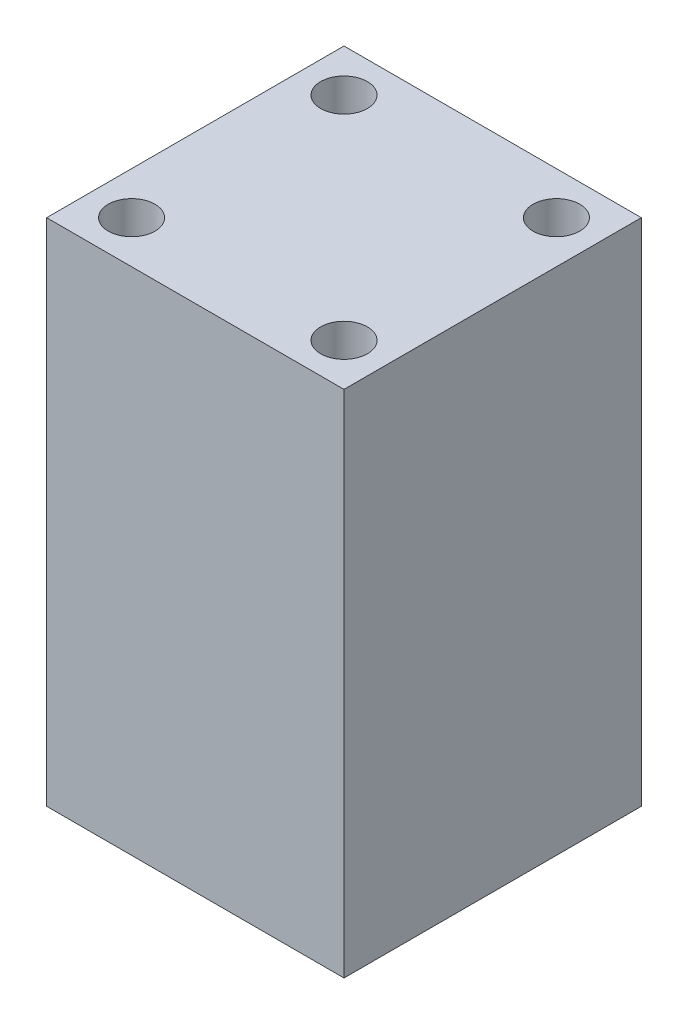
ISO-10303-21;
HEADER;
FILE_DESCRIPTION(('STEP AP214'),'2;1');
FILE_NAME('part.step','',(''),(''),'','','');
FILE_SCHEMA(('AUTOMOTIVE_DESIGN { 1 0 10303 214 1 1 1 1 }'));
ENDSEC;
DATA;
#1=APPLICATION_CONTEXT('core data for automotive mechanical design processes');
#2=APPLICATION_PROTOCOL_DEFINITION('international standard','automotive_design',2000,#1);
#3=PRODUCT_CONTEXT('',#1,'mechanical');
#4=PRODUCT('Part','Part','',(#3));
#5=PRODUCT_RELATED_PRODUCT_CATEGORY('part','',(#4));
#6=PRODUCT_DEFINITION_FORMATION('','',#4);
#7=PRODUCT_DEFINITION_CONTEXT('part definition',#1,'design');
#8=PRODUCT_DEFINITION('design','',#6,#7);
#9=PRODUCT_DEFINITION_SHAPE('','',#8);
#10=(LENGTH_UNIT() NAMED_UNIT(*) SI_UNIT(.MILLI.,.METRE.));
#11=(NAMED_UNIT(*) PLANE_ANGLE_UNIT() SI_UNIT($,.RADIAN.));
#12=(NAMED_UNIT(*) SI_UNIT($,.STERADIAN.) SOLID_ANGLE_UNIT());
#13=UNCERTAINTY_MEASURE_WITH_UNIT(LENGTH_MEASURE(1.E-05),#10,'distance_accuracy_value','');
#14=(GEOMETRIC_REPRESENTATION_CONTEXT(3) GLOBAL_UNCERTAINTY_ASSIGNED_CONTEXT((#13)) GLOBAL_UNIT_ASSIGNED_CONTEXT((#10,
#11,#12)) REPRESENTATION_CONTEXT('',''));
#15=CARTESIAN_POINT('',(0.,0.,0.));
#16=DIRECTION('',(0.,0.,1.));
#17=DIRECTION('',(1.,0.,0.));
#18=AXIS2_PLACEMENT_3D('',#15,#16,#17);
#19=CARTESIAN_POINT('',(17.5,30.,-17.5));
#20=DIRECTION('',(-1.,0.,0.));
#21=DIRECTION('',(0.,0.,1.));
#22=AXIS2_PLACEMENT_3D('',#19,#20,#21);
#23=PLANE('',#22);
#24=DIRECTION('',(0.,0.,-1.));
#25=VECTOR('',#24,1.);
#26=CARTESIAN_POINT('',(17.5,-30.,-17.5));
#27=LINE('',#26,#25);
#28=CARTESIAN_POINT('',(17.5,-30.,17.5));
#29=VERTEX_POINT('',#28);
#30=CARTESIAN_POINT('',(17.5,-30.,-17.5));
#31=VERTEX_POINT('',#30);
#32=EDGE_CURVE('E206',#29,#31,#27,.T.);
#33=ORIENTED_EDGE('',*,*,#32,.T.);
#34=DIRECTION('',(0.,-1.,0.));
#35=VECTOR('',#34,1.);
#36=CARTESIAN_POINT('',(17.5,30.,-17.5));
#37=LINE('',#36,#35);
#38=CARTESIAN_POINT('',(17.5,30.,-17.5));
#39=VERTEX_POINT('',#38);
#40=EDGE_CURVE('E11',#39,#31,#37,.T.);
#41=ORIENTED_EDGE('',*,*,#40,.F.);
#42=DIRECTION('',(0.,0.,-1.));
#43=VECTOR('',#42,1.);
#44=CARTESIAN_POINT('',(17.5,30.,-17.5));
#45=LINE('',#44,#43);
#46=CARTESIAN_POINT('',(17.5,30.,17.5));
#47=VERTEX_POINT('',#46);
#48=EDGE_CURVE('E207',#47,#39,#45,.T.);
#49=ORIENTED_EDGE('',*,*,#48,.F.);
#50=DIRECTION('',(0.,-1.,0.));
#51=VECTOR('',#50,1.);
#52=CARTESIAN_POINT('',(17.5,30.,17.5));
#53=LINE('',#52,#51);
#54=EDGE_CURVE('E213',#47,#29,#53,.T.);
#55=ORIENTED_EDGE('',*,*,#54,.T.);
#56=EDGE_LOOP('',(#33,#41,#49,#55));
#57=FACE_BOUND('',#56,.T.);
#58=ADVANCED_FACE('F41',(#57),#23,.F.);
#59=CARTESIAN_POINT('',(-17.5,30.,-17.5));
#60=DIRECTION('',(0.,0.,1.));
#61=DIRECTION('',(1.,0.,0.));
#62=AXIS2_PLACEMENT_3D('',#59,#60,#61);
#63=PLANE('',#62);
#64=DIRECTION('',(-1.,0.,0.));
#65=VECTOR('',#64,1.);
#66=CARTESIAN_POINT('',(-17.5,-30.,-17.5));
#67=LINE('',#66,#65);
#68=CARTESIAN_POINT('',(-17.5,-30.,-17.5));
#69=VERTEX_POINT('',#68);
#70=EDGE_CURVE('E216',#31,#69,#67,.T.);
#71=ORIENTED_EDGE('',*,*,#70,.T.);
#72=DIRECTION('',(0.,-1.,0.));
#73=VECTOR('',#72,1.);
#74=CARTESIAN_POINT('',(-17.5,30.,-17.5));
#75=LINE('',#74,#73);
#76=CARTESIAN_POINT('',(-17.5,30.,-17.5));
#77=VERTEX_POINT('',#76);
#78=EDGE_CURVE('E49',#77,#69,#75,.T.);
#79=ORIENTED_EDGE('',*,*,#78,.F.);
#80=DIRECTION('',(-1.,0.,0.));
#81=VECTOR('',#80,1.);
#82=CARTESIAN_POINT('',(-17.5,30.,-17.5));
#83=LINE('',#82,#81);
#84=EDGE_CURVE('E88',#39,#77,#83,.T.);
#85=ORIENTED_EDGE('',*,*,#84,.F.);
#86=ORIENTED_EDGE('',*,*,#40,.T.);
#87=EDGE_LOOP('',(#71,#79,#85,#86));
#88=FACE_BOUND('',#87,.T.);
#89=ADVANCED_FACE('F242',(#88),#63,.F.);
#90=CARTESIAN_POINT('',(-17.5,30.,-17.5));
#91=DIRECTION('',(1.,0.,0.));
#92=DIRECTION('',(0.,0.,-1.));
#93=AXIS2_PLACEMENT_3D('',#90,#91,#92);
#94=PLANE('',#93);
#95=CARTESIAN_POINT('',(-17.5,-15.,-12.5));
#96=DIRECTION('',(-1.,0.,0.));
#97=DIRECTION('',(0.,0.,1.));
#98=AXIS2_PLACEMENT_3D('',#95,#96,#97);
#99=CIRCLE('',#98,2.24999999999999);
#100=CARTESIAN_POINT('',(-17.5,-15.,-10.25));
#101=VERTEX_POINT('',#100);
#102=EDGE_CURVE('E136',#101,#101,#99,.T.);
#103=ORIENTED_EDGE('',*,*,#102,.F.);
#104=EDGE_LOOP('',(#103));
#105=FACE_BOUND('',#104,.T.);
#106=CARTESIAN_POINT('',(-17.5,-15.,12.5));
#107=DIRECTION('',(-1.,0.,0.));
#108=DIRECTION('',(0.,0.,1.));
#109=AXIS2_PLACEMENT_3D('',#106,#107,#108);
#110=CIRCLE('',#109,2.24999999999999);
#111=CARTESIAN_POINT('',(-17.5,-15.,14.75));
#112=VERTEX_POINT('',#111);
#113=EDGE_CURVE('E135',#112,#112,#110,.T.);
#114=ORIENTED_EDGE('',*,*,#113,.F.);
#115=EDGE_LOOP('',(#114));
#116=FACE_BOUND('',#115,.T.);
#117=CARTESIAN_POINT('',(-17.5,15.,12.5));
#118=DIRECTION('',(-1.,0.,0.));
#119=DIRECTION('',(0.,0.,1.));
#120=AXIS2_PLACEMENT_3D('',#117,#118,#119);
#121=CIRCLE('',#120,2.24999999999999);
#122=CARTESIAN_POINT('',(-17.5,15.,14.75));
#123=VERTEX_POINT('',#122);
#124=EDGE_CURVE('E146',#123,#123,#121,.T.);
#125=ORIENTED_EDGE('',*,*,#124,.F.);
#126=EDGE_LOOP('',(#125));
#127=FACE_BOUND('',#126,.T.);
#128=CARTESIAN_POINT('',(-17.5,15.,-12.5));
#129=DIRECTION('',(-1.,0.,0.));
#130=DIRECTION('',(0.,0.,1.));
#131=AXIS2_PLACEMENT_3D('',#128,#129,#130);
#132=CIRCLE('',#131,2.24999999999999);
#133=CARTESIAN_POINT('',(-17.5,15.,-10.25));
#134=VERTEX_POINT('',#133);
#135=EDGE_CURVE('E152',#134,#134,#132,.T.);
#136=ORIENTED_EDGE('',*,*,#135,.F.);
#137=EDGE_LOOP('',(#136));
#138=FACE_BOUND('',#137,.T.);
#139=DIRECTION('',(0.,0.,1.));
#140=VECTOR('',#139,1.);
#141=CARTESIAN_POINT('',(-17.5,-30.,-17.5));
#142=LINE('',#141,#140);
#143=CARTESIAN_POINT('',(-17.5,-30.,17.5));
#144=VERTEX_POINT('',#143);
#145=EDGE_CURVE('E75',#69,#144,#142,.T.);
#146=ORIENTED_EDGE('',*,*,#145,.T.);
#147=DIRECTION('',(0.,-1.,0.));
#148=VECTOR('',#147,1.);
#149=CARTESIAN_POINT('',(-17.5,30.,17.5));
#150=LINE('',#149,#148);
#151=CARTESIAN_POINT('',(-17.5,30.,17.5));
#152=VERTEX_POINT('',#151);
#153=EDGE_CURVE('E221',#152,#144,#150,.T.);
#154=ORIENTED_EDGE('',*,*,#153,.F.);
#155=DIRECTION('',(0.,0.,1.));
#156=VECTOR('',#155,1.);
#157=CARTESIAN_POINT('',(-17.5,30.,-17.5));
#158=LINE('',#157,#156);
#159=EDGE_CURVE('E210',#77,#152,#158,.T.);
#160=ORIENTED_EDGE('',*,*,#159,.F.);
#161=ORIENTED_EDGE('',*,*,#78,.T.);
#162=EDGE_LOOP('',(#146,#154,#160,#161));
#163=FACE_BOUND('',#162,.T.);
#164=ADVANCED_FACE('F223',(#105,#116,#127,#138,#163),#94,.F.);
#165=CARTESIAN_POINT('',(-17.5,30.,17.5));
#166=DIRECTION('',(0.,0.,-1.));
#167=DIRECTION('',(-1.,0.,0.));
#168=AXIS2_PLACEMENT_3D('',#165,#166,#167);
#169=PLANE('',#168);
#170=DIRECTION('',(1.,0.,0.));
#171=VECTOR('',#170,1.);
#172=CARTESIAN_POINT('',(-17.5,-30.,17.5));
#173=LINE('',#172,#171);
#174=EDGE_CURVE('E81',#144,#29,#173,.T.);
#175=ORIENTED_EDGE('',*,*,#174,.T.);
#176=ORIENTED_EDGE('',*,*,#54,.F.);
#177=DIRECTION('',(1.,0.,0.));
#178=VECTOR('',#177,1.);
#179=CARTESIAN_POINT('',(-17.5,30.,17.5));
#180=LINE('',#179,#178);
#181=EDGE_CURVE('E57',#152,#47,#180,.T.);
#182=ORIENTED_EDGE('',*,*,#181,.F.);
#183=ORIENTED_EDGE('',*,*,#153,.T.);
#184=EDGE_LOOP('',(#175,#176,#182,#183));
#185=FACE_BOUND('',#184,.T.);
#186=ADVANCED_FACE('F230',(#185),#169,.F.);
#187=CARTESIAN_POINT('',(0.,30.,0.));
#188=DIRECTION('',(0.,1.,0.));
#189=DIRECTION('',(0.,0.,1.));
#190=AXIS2_PLACEMENT_3D('',#187,#188,#189);
#191=PLANE('',#190);
#192=CARTESIAN_POINT('',(-12.5,30.,12.5));
#193=DIRECTION('',(0.,1.,0.));
#194=DIRECTION('',(0.,0.,1.));
#195=AXIS2_PLACEMENT_3D('',#192,#193,#194);
#196=CIRCLE('',#195,2.74999999999999);
#197=CARTESIAN_POINT('',(-12.5,30.,15.25));
#198=VERTEX_POINT('',#197);
#199=EDGE_CURVE('E182',#198,#198,#196,.T.);
#200=ORIENTED_EDGE('',*,*,#199,.F.);
#201=EDGE_LOOP('',(#200));
#202=FACE_BOUND('',#201,.T.);
#203=CARTESIAN_POINT('',(12.5,30.,12.5));
#204=DIRECTION('',(0.,1.,0.));
#205=DIRECTION('',(0.,0.,1.));
#206=AXIS2_PLACEMENT_3D('',#203,#204,#205);
#207=CIRCLE('',#206,2.74999999999999);
#208=CARTESIAN_POINT('',(12.5,30.,15.25));
#209=VERTEX_POINT('',#208);
#210=EDGE_CURVE('E188',#209,#209,#207,.T.);
#211=ORIENTED_EDGE('',*,*,#210,.F.);
#212=EDGE_LOOP('',(#211));
#213=FACE_BOUND('',#212,.T.);
#214=CARTESIAN_POINT('',(12.5,30.,-12.5));
#215=DIRECTION('',(0.,1.,0.));
#216=DIRECTION('',(0.,0.,1.));
#217=AXIS2_PLACEMENT_3D('',#214,#215,#216);
#218=CIRCLE('',#217,2.74999999999999);
#219=CARTESIAN_POINT('',(12.5,30.,-9.75000000000001));
#220=VERTEX_POINT('',#219);
#221=EDGE_CURVE('E194',#220,#220,#218,.T.);
#222=ORIENTED_EDGE('',*,*,#221,.F.);
#223=EDGE_LOOP('',(#222));
#224=FACE_BOUND('',#223,.T.);
#225=CARTESIAN_POINT('',(-12.5,30.,-12.5));
#226=DIRECTION('',(0.,1.,0.));
#227=DIRECTION('',(0.,0.,1.));
#228=AXIS2_PLACEMENT_3D('',#225,#226,#227);
#229=CIRCLE('',#228,2.74999999999999);
#230=CARTESIAN_POINT('',(-12.5,30.,-9.75000000000001));
#231=VERTEX_POINT('',#230);
#232=EDGE_CURVE('E200',#231,#231,#229,.T.);
#233=ORIENTED_EDGE('',*,*,#232,.F.);
#234=EDGE_LOOP('',(#233));
#235=FACE_BOUND('',#234,.T.);
#236=ORIENTED_EDGE('',*,*,#48,.T.);
#237=ORIENTED_EDGE('',*,*,#84,.T.);
#238=ORIENTED_EDGE('',*,*,#159,.T.);
#239=ORIENTED_EDGE('',*,*,#181,.T.);
#240=EDGE_LOOP('',(#236,#237,#238,#239));
#241=FACE_BOUND('',#240,.T.);
#242=ADVANCED_FACE('F232',(#202,#213,#224,#235,#241),#191,.T.);
#243=CARTESIAN_POINT('',(0.,-30.,0.));
#244=DIRECTION('',(0.,1.,0.));
#245=DIRECTION('',(0.,0.,1.));
#246=AXIS2_PLACEMENT_3D('',#243,#244,#245);
#247=PLANE('',#246);
#248=CARTESIAN_POINT('',(-12.5,-30.,-12.5));
#249=DIRECTION('',(0.,-1.,0.));
#250=DIRECTION('',(0.,0.,-1.));
#251=AXIS2_PLACEMENT_3D('',#248,#249,#250);
#252=CIRCLE('',#251,2.74999999999999);
#253=CARTESIAN_POINT('',(-12.5,-30.,-15.25));
#254=VERTEX_POINT('',#253);
#255=EDGE_CURVE('E158',#254,#254,#252,.T.);
#256=ORIENTED_EDGE('',*,*,#255,.F.);
#257=EDGE_LOOP('',(#256));
#258=FACE_BOUND('',#257,.T.);
#259=CARTESIAN_POINT('',(12.5,-30.,-12.5));
#260=DIRECTION('',(0.,-1.,0.));
#261=DIRECTION('',(0.,0.,-1.));
#262=AXIS2_PLACEMENT_3D('',#259,#260,#261);
#263=CIRCLE('',#262,2.74999999999999);
#264=CARTESIAN_POINT('',(12.5,-30.,-15.25));
#265=VERTEX_POINT('',#264);
#266=EDGE_CURVE('E164',#265,#265,#263,.T.);
#267=ORIENTED_EDGE('',*,*,#266,.F.);
#268=EDGE_LOOP('',(#267));
#269=FACE_BOUND('',#268,.T.);
#270=CARTESIAN_POINT('',(-12.5,-30.,12.5));
#271=DIRECTION('',(0.,-1.,0.));
#272=DIRECTION('',(0.,0.,-1.));
#273=AXIS2_PLACEMENT_3D('',#270,#271,#272);
#274=CIRCLE('',#273,2.74999999999999);
#275=CARTESIAN_POINT('',(-12.5,-30.,9.75000000000001));
#276=VERTEX_POINT('',#275);
#277=EDGE_CURVE('E170',#276,#276,#274,.T.);
#278=ORIENTED_EDGE('',*,*,#277,.F.);
#279=EDGE_LOOP('',(#278));
#280=FACE_BOUND('',#279,.T.);
#281=CARTESIAN_POINT('',(12.5,-30.,12.5));
#282=DIRECTION('',(0.,-1.,0.));
#283=DIRECTION('',(0.,0.,-1.));
#284=AXIS2_PLACEMENT_3D('',#281,#282,#283);
#285=CIRCLE('',#284,2.74999999999999);
#286=CARTESIAN_POINT('',(12.5,-30.,9.75000000000001));
#287=VERTEX_POINT('',#286);
#288=EDGE_CURVE('E176',#287,#287,#285,.T.);
#289=ORIENTED_EDGE('',*,*,#288,.F.);
#290=EDGE_LOOP('',(#289));
#291=FACE_BOUND('',#290,.T.);
#292=ORIENTED_EDGE('',*,*,#32,.F.);
#293=ORIENTED_EDGE('',*,*,#174,.F.);
#294=ORIENTED_EDGE('',*,*,#145,.F.);
#295=ORIENTED_EDGE('',*,*,#70,.F.);
#296=EDGE_LOOP('',(#292,#293,#294,#295));
#297=FACE_BOUND('',#296,.T.);
#298=ADVANCED_FACE('F226',(#258,#269,#280,#291,#297),#247,.F.);
#299=CARTESIAN_POINT('',(-12.5,22.,-12.5));
#300=DIRECTION('',(0.,1.,0.));
#301=DIRECTION('',(0.,0.,1.));
#302=AXIS2_PLACEMENT_3D('',#299,#300,#301);
#303=CONICAL_SURFACE('',#302,2.74999999999999,1.02974425867665);
#304=CARTESIAN_POINT('',(-12.5,20.3476332976742,-12.5));
#305=VERTEX_POINT('',#304);
#306=VERTEX_LOOP('',#305);
#307=FACE_BOUND('',#306,.T.);
#308=CARTESIAN_POINT('',(-12.5,22.,-12.5));
#309=DIRECTION('',(0.,1.,0.));
#310=DIRECTION('',(0.,0.,1.));
#311=AXIS2_PLACEMENT_3D('',#308,#309,#310);
#312=CIRCLE('',#311,2.74999999999999);
#313=CARTESIAN_POINT('',(-12.5,22.,-9.75000000000001));
#314=VERTEX_POINT('',#313);
#315=EDGE_CURVE('E203',#314,#314,#312,.T.);
#316=ORIENTED_EDGE('',*,*,#315,.T.);
#317=EDGE_LOOP('',(#316));
#318=FACE_BOUND('',#317,.T.);
#319=ADVANCED_FACE('F284',(#307,#318),#303,.F.);
#320=CARTESIAN_POINT('',(-12.5,30.,-12.5));
#321=DIRECTION('',(0.,1.,0.));
#322=DIRECTION('',(0.,0.,1.));
#323=AXIS2_PLACEMENT_3D('',#320,#321,#322);
#324=CYLINDRICAL_SURFACE('',#323,2.74999999999999);
#325=ORIENTED_EDGE('',*,*,#315,.F.);
#326=EDGE_LOOP('',(#325));
#327=FACE_BOUND('',#326,.T.);
#328=ORIENTED_EDGE('',*,*,#232,.T.);
#329=EDGE_LOOP('',(#328));
#330=FACE_BOUND('',#329,.T.);
#331=ADVANCED_FACE('F294',(#327,#330),#324,.F.);
#332=CARTESIAN_POINT('',(12.5,22.,-12.5));
#333=DIRECTION('',(0.,1.,0.));
#334=DIRECTION('',(0.,0.,1.));
#335=AXIS2_PLACEMENT_3D('',#332,#333,#334);
#336=CONICAL_SURFACE('',#335,2.74999999999999,1.02974425867665);
#337=CARTESIAN_POINT('',(12.5,20.3476332976742,-12.5));
#338=VERTEX_POINT('',#337);
#339=VERTEX_LOOP('',#338);
#340=FACE_BOUND('',#339,.T.);
#341=CARTESIAN_POINT('',(12.5,22.,-12.5));
#342=DIRECTION('',(0.,1.,0.));
#343=DIRECTION('',(0.,0.,1.));
#344=AXIS2_PLACEMENT_3D('',#341,#342,#343);
#345=CIRCLE('',#344,2.74999999999999);
#346=CARTESIAN_POINT('',(12.5,22.,-9.75000000000001));
#347=VERTEX_POINT('',#346);
#348=EDGE_CURVE('E197',#347,#347,#345,.T.);
#349=ORIENTED_EDGE('',*,*,#348,.T.);
#350=EDGE_LOOP('',(#349));
#351=FACE_BOUND('',#350,.T.);
#352=ADVANCED_FACE('F304',(#340,#351),#336,.F.);
#353=CARTESIAN_POINT('',(12.5,30.,-12.5));
#354=DIRECTION('',(0.,1.,0.));
#355=DIRECTION('',(0.,0.,1.));
#356=AXIS2_PLACEMENT_3D('',#353,#354,#355);
#357=CYLINDRICAL_SURFACE('',#356,2.74999999999999);
#358=ORIENTED_EDGE('',*,*,#348,.F.);
#359=EDGE_LOOP('',(#358));
#360=FACE_BOUND('',#359,.T.);
#361=ORIENTED_EDGE('',*,*,#221,.T.);
#362=EDGE_LOOP('',(#361));
#363=FACE_BOUND('',#362,.T.);
#364=ADVANCED_FACE('F314',(#360,#363),#357,.F.);
#365=CARTESIAN_POINT('',(12.5,22.,12.5));
#366=DIRECTION('',(0.,1.,0.));
#367=DIRECTION('',(0.,0.,1.));
#368=AXIS2_PLACEMENT_3D('',#365,#366,#367);
#369=CONICAL_SURFACE('',#368,2.74999999999999,1.02974425867665);
#370=CARTESIAN_POINT('',(12.5,20.3476332976742,12.5));
#371=VERTEX_POINT('',#370);
#372=VERTEX_LOOP('',#371);
#373=FACE_BOUND('',#372,.T.);
#374=CARTESIAN_POINT('',(12.5,22.,12.5));
#375=DIRECTION('',(0.,1.,0.));
#376=DIRECTION('',(0.,0.,1.));
#377=AXIS2_PLACEMENT_3D('',#374,#375,#376);
#378=CIRCLE('',#377,2.74999999999999);
#379=CARTESIAN_POINT('',(12.5,22.,15.25));
#380=VERTEX_POINT('',#379);
#381=EDGE_CURVE('E191',#380,#380,#378,.T.);
#382=ORIENTED_EDGE('',*,*,#381,.T.);
#383=EDGE_LOOP('',(#382));
#384=FACE_BOUND('',#383,.T.);
#385=ADVANCED_FACE('F323',(#373,#384),#369,.F.);
#386=CARTESIAN_POINT('',(12.5,30.,12.5));
#387=DIRECTION('',(0.,1.,0.));
#388=DIRECTION('',(0.,0.,1.));
#389=AXIS2_PLACEMENT_3D('',#386,#387,#388);
#390=CYLINDRICAL_SURFACE('',#389,2.74999999999999);
#391=ORIENTED_EDGE('',*,*,#381,.F.);
#392=EDGE_LOOP('',(#391));
#393=FACE_BOUND('',#392,.T.);
#394=ORIENTED_EDGE('',*,*,#210,.T.);
#395=EDGE_LOOP('',(#394));
#396=FACE_BOUND('',#395,.T.);
#397=ADVANCED_FACE('F332',(#393,#396),#390,.F.);
#398=CARTESIAN_POINT('',(-12.5,22.,12.5));
#399=DIRECTION('',(0.,1.,0.));
#400=DIRECTION('',(0.,0.,1.));
#401=AXIS2_PLACEMENT_3D('',#398,#399,#400);
#402=CONICAL_SURFACE('',#401,2.74999999999999,1.02974425867665);
#403=CARTESIAN_POINT('',(-12.5,20.3476332976742,12.5));
#404=VERTEX_POINT('',#403);
#405=VERTEX_LOOP('',#404);
#406=FACE_BOUND('',#405,.T.);
#407=CARTESIAN_POINT('',(-12.5,22.,12.5));
#408=DIRECTION('',(0.,1.,0.));
#409=DIRECTION('',(0.,0.,1.));
#410=AXIS2_PLACEMENT_3D('',#407,#408,#409);
#411=CIRCLE('',#410,2.74999999999999);
#412=CARTESIAN_POINT('',(-12.5,22.,15.25));
#413=VERTEX_POINT('',#412);
#414=EDGE_CURVE('E185',#413,#413,#411,.T.);
#415=ORIENTED_EDGE('',*,*,#414,.T.);
#416=EDGE_LOOP('',(#415));
#417=FACE_BOUND('',#416,.T.);
#418=ADVANCED_FACE('F342',(#406,#417),#402,.F.);
#419=CARTESIAN_POINT('',(-12.5,30.,12.5));
#420=DIRECTION('',(0.,1.,0.));
#421=DIRECTION('',(0.,0.,1.));
#422=AXIS2_PLACEMENT_3D('',#419,#420,#421);
#423=CYLINDRICAL_SURFACE('',#422,2.74999999999999);
#424=ORIENTED_EDGE('',*,*,#414,.F.);
#425=EDGE_LOOP('',(#424));
#426=FACE_BOUND('',#425,.T.);
#427=ORIENTED_EDGE('',*,*,#199,.T.);
#428=EDGE_LOOP('',(#427));
#429=FACE_BOUND('',#428,.T.);
#430=ADVANCED_FACE('F352',(#426,#429),#423,.F.);
#431=CARTESIAN_POINT('',(12.5,-22.,12.5));
#432=DIRECTION('',(0.,-1.,0.));
#433=DIRECTION('',(0.,0.,-1.));
#434=AXIS2_PLACEMENT_3D('',#431,#432,#433);
#435=CONICAL_SURFACE('',#434,2.74999999999999,1.02974425867665);
#436=CARTESIAN_POINT('',(12.5,-20.3476332976742,12.5));
#437=VERTEX_POINT('',#436);
#438=VERTEX_LOOP('',#437);
#439=FACE_BOUND('',#438,.T.);
#440=CARTESIAN_POINT('',(12.5,-22.,12.5));
#441=DIRECTION('',(0.,-1.,0.));
#442=DIRECTION('',(0.,0.,-1.));
#443=AXIS2_PLACEMENT_3D('',#440,#441,#442);
#444=CIRCLE('',#443,2.74999999999999);
#445=CARTESIAN_POINT('',(12.5,-22.,9.75000000000001));
#446=VERTEX_POINT('',#445);
#447=EDGE_CURVE('E179',#446,#446,#444,.T.);
#448=ORIENTED_EDGE('',*,*,#447,.T.);
#449=EDGE_LOOP('',(#448));
#450=FACE_BOUND('',#449,.T.);
#451=ADVANCED_FACE('F361',(#439,#450),#435,.F.);
#452=CARTESIAN_POINT('',(12.5,-30.,12.5));
#453=DIRECTION('',(0.,-1.,0.));
#454=DIRECTION('',(0.,0.,-1.));
#455=AXIS2_PLACEMENT_3D('',#452,#453,#454);
#456=CYLINDRICAL_SURFACE('',#455,2.74999999999999);
#457=ORIENTED_EDGE('',*,*,#447,.F.);
#458=EDGE_LOOP('',(#457));
#459=FACE_BOUND('',#458,.T.);
#460=ORIENTED_EDGE('',*,*,#288,.T.);
#461=EDGE_LOOP('',(#460));
#462=FACE_BOUND('',#461,.T.);
#463=ADVANCED_FACE('F370',(#459,#462),#456,.F.);
#464=CARTESIAN_POINT('',(-12.5,-22.,12.5));
#465=DIRECTION('',(0.,-1.,0.));
#466=DIRECTION('',(0.,0.,-1.));
#467=AXIS2_PLACEMENT_3D('',#464,#465,#466);
#468=CONICAL_SURFACE('',#467,2.74999999999999,1.02974425867665);
#469=CARTESIAN_POINT('',(-12.5,-20.3476332976742,12.5));
#470=VERTEX_POINT('',#469);
#471=VERTEX_LOOP('',#470);
#472=FACE_BOUND('',#471,.T.);
#473=CARTESIAN_POINT('',(-12.5,-22.,12.5));
#474=DIRECTION('',(0.,-1.,0.));
#475=DIRECTION('',(0.,0.,-1.));
#476=AXIS2_PLACEMENT_3D('',#473,#474,#475);
#477=CIRCLE('',#476,2.74999999999999);
#478=CARTESIAN_POINT('',(-12.5,-22.,9.75000000000001));
#479=VERTEX_POINT('',#478);
#480=EDGE_CURVE('E173',#479,#479,#477,.T.);
#481=ORIENTED_EDGE('',*,*,#480,.T.);
#482=EDGE_LOOP('',(#481));
#483=FACE_BOUND('',#482,.T.);
#484=ADVANCED_FACE('F380',(#472,#483),#468,.F.);
#485=CARTESIAN_POINT('',(-12.5,-30.,12.5));
#486=DIRECTION('',(0.,-1.,0.));
#487=DIRECTION('',(0.,0.,-1.));
#488=AXIS2_PLACEMENT_3D('',#485,#486,#487);
#489=CYLINDRICAL_SURFACE('',#488,2.74999999999999);
#490=ORIENTED_EDGE('',*,*,#480,.F.);
#491=EDGE_LOOP('',(#490));
#492=FACE_BOUND('',#491,.T.);
#493=ORIENTED_EDGE('',*,*,#277,.T.);
#494=EDGE_LOOP('',(#493));
#495=FACE_BOUND('',#494,.T.);
#496=ADVANCED_FACE('F390',(#492,#495),#489,.F.);
#497=CARTESIAN_POINT('',(12.5,-22.,-12.5));
#498=DIRECTION('',(0.,-1.,0.));
#499=DIRECTION('',(0.,0.,-1.));
#500=AXIS2_PLACEMENT_3D('',#497,#498,#499);
#501=CONICAL_SURFACE('',#500,2.74999999999999,1.02974425867665);
#502=CARTESIAN_POINT('',(12.5,-20.3476332976742,-12.5));
#503=VERTEX_POINT('',#502);
#504=VERTEX_LOOP('',#503);
#505=FACE_BOUND('',#504,.T.);
#506=CARTESIAN_POINT('',(12.5,-22.,-12.5));
#507=DIRECTION('',(0.,-1.,0.));
#508=DIRECTION('',(0.,0.,-1.));
#509=AXIS2_PLACEMENT_3D('',#506,#507,#508);
#510=CIRCLE('',#509,2.74999999999999);
#511=CARTESIAN_POINT('',(12.5,-22.,-15.25));
#512=VERTEX_POINT('',#511);
#513=EDGE_CURVE('E167',#512,#512,#510,.T.);
#514=ORIENTED_EDGE('',*,*,#513,.T.);
#515=EDGE_LOOP('',(#514));
#516=FACE_BOUND('',#515,.T.);
#517=ADVANCED_FACE('F400',(#505,#516),#501,.F.);
#518=CARTESIAN_POINT('',(12.5,-30.,-12.5));
#519=DIRECTION('',(0.,-1.,0.));
#520=DIRECTION('',(0.,0.,-1.));
#521=AXIS2_PLACEMENT_3D('',#518,#519,#520);
#522=CYLINDRICAL_SURFACE('',#521,2.74999999999999);
#523=ORIENTED_EDGE('',*,*,#513,.F.);
#524=EDGE_LOOP('',(#523));
#525=FACE_BOUND('',#524,.T.);
#526=ORIENTED_EDGE('',*,*,#266,.T.);
#527=EDGE_LOOP('',(#526));
#528=FACE_BOUND('',#527,.T.);
#529=ADVANCED_FACE('F410',(#525,#528),#522,.F.);
#530=CARTESIAN_POINT('',(-12.5,-22.,-12.5));
#531=DIRECTION('',(0.,-1.,0.));
#532=DIRECTION('',(0.,0.,-1.));
#533=AXIS2_PLACEMENT_3D('',#530,#531,#532);
#534=CONICAL_SURFACE('',#533,2.74999999999999,1.02974425867665);
#535=CARTESIAN_POINT('',(-12.5,-20.3476332976742,-12.5));
#536=VERTEX_POINT('',#535);
#537=VERTEX_LOOP('',#536);
#538=FACE_BOUND('',#537,.T.);
#539=CARTESIAN_POINT('',(-12.5,-22.,-12.5));
#540=DIRECTION('',(0.,-1.,0.));
#541=DIRECTION('',(0.,0.,-1.));
#542=AXIS2_PLACEMENT_3D('',#539,#540,#541);
#543=CIRCLE('',#542,2.74999999999999);
#544=CARTESIAN_POINT('',(-12.5,-22.,-15.25));
#545=VERTEX_POINT('',#544);
#546=EDGE_CURVE('E161',#545,#545,#543,.T.);
#547=ORIENTED_EDGE('',*,*,#546,.T.);
#548=EDGE_LOOP('',(#547));
#549=FACE_BOUND('',#548,.T.);
#550=ADVANCED_FACE('F420',(#538,#549),#534,.F.);
#551=CARTESIAN_POINT('',(-12.5,-30.,-12.5));
#552=DIRECTION('',(0.,-1.,0.));
#553=DIRECTION('',(0.,0.,-1.));
#554=AXIS2_PLACEMENT_3D('',#551,#552,#553);
#555=CYLINDRICAL_SURFACE('',#554,2.74999999999999);
#556=ORIENTED_EDGE('',*,*,#546,.F.);
#557=EDGE_LOOP('',(#556));
#558=FACE_BOUND('',#557,.T.);
#559=ORIENTED_EDGE('',*,*,#255,.T.);
#560=EDGE_LOOP('',(#559));
#561=FACE_BOUND('',#560,.T.);
#562=ADVANCED_FACE('F430',(#558,#561),#555,.F.);
#563=CARTESIAN_POINT('',(-9.50000000000001,15.,-12.5));
#564=DIRECTION('',(-1.,0.,0.));
#565=DIRECTION('',(0.,0.,1.));
#566=AXIS2_PLACEMENT_3D('',#563,#564,#565);
#567=CONICAL_SURFACE('',#566,2.24999999999999,1.02974425867665);
#568=CARTESIAN_POINT('',(-8.14806360718799,15.,-12.5));
#569=VERTEX_POINT('',#568);
#570=VERTEX_LOOP('',#569);
#571=FACE_BOUND('',#570,.T.);
#572=CARTESIAN_POINT('',(-9.50000000000001,15.,-12.5));
#573=DIRECTION('',(-1.,0.,0.));
#574=DIRECTION('',(0.,0.,1.));
#575=AXIS2_PLACEMENT_3D('',#572,#573,#574);
#576=CIRCLE('',#575,2.24999999999999);
#577=CARTESIAN_POINT('',(-9.50000000000001,15.,-10.25));
#578=VERTEX_POINT('',#577);
#579=EDGE_CURVE('E155',#578,#578,#576,.T.);
#580=ORIENTED_EDGE('',*,*,#579,.T.);
#581=EDGE_LOOP('',(#580));
#582=FACE_BOUND('',#581,.T.);
#583=ADVANCED_FACE('F440',(#571,#582),#567,.F.);
#584=CARTESIAN_POINT('',(-17.5,15.,-12.5));
#585=DIRECTION('',(-1.,0.,0.));
#586=DIRECTION('',(0.,0.,1.));
#587=AXIS2_PLACEMENT_3D('',#584,#585,#586);
#588=CYLINDRICAL_SURFACE('',#587,2.24999999999999);
#589=ORIENTED_EDGE('',*,*,#579,.F.);
#590=EDGE_LOOP('',(#589));
#591=FACE_BOUND('',#590,.T.);
#592=ORIENTED_EDGE('',*,*,#135,.T.);
#593=EDGE_LOOP('',(#592));
#594=FACE_BOUND('',#593,.T.);
#595=ADVANCED_FACE('F450',(#591,#594),#588,.F.);
#596=CARTESIAN_POINT('',(-9.50000000000001,15.,12.5));
#597=DIRECTION('',(-1.,0.,0.));
#598=DIRECTION('',(0.,0.,1.));
#599=AXIS2_PLACEMENT_3D('',#596,#597,#598);
#600=CONICAL_SURFACE('',#599,2.24999999999999,1.02974425867665);
#601=CARTESIAN_POINT('',(-8.14806360718799,15.,12.5));
#602=VERTEX_POINT('',#601);
#603=VERTEX_LOOP('',#602);
#604=FACE_BOUND('',#603,.T.);
#605=CARTESIAN_POINT('',(-9.50000000000001,15.,12.5));
#606=DIRECTION('',(-1.,0.,0.));
#607=DIRECTION('',(0.,0.,1.));
#608=AXIS2_PLACEMENT_3D('',#605,#606,#607);
#609=CIRCLE('',#608,2.24999999999999);
#610=CARTESIAN_POINT('',(-9.50000000000001,15.,14.75));
#611=VERTEX_POINT('',#610);
#612=EDGE_CURVE('E149',#611,#611,#609,.T.);
#613=ORIENTED_EDGE('',*,*,#612,.T.);
#614=EDGE_LOOP('',(#613));
#615=FACE_BOUND('',#614,.T.);
#616=ADVANCED_FACE('F460',(#604,#615),#600,.F.);
#617=CARTESIAN_POINT('',(-17.5,15.,12.5));
#618=DIRECTION('',(-1.,0.,0.));
#619=DIRECTION('',(0.,0.,1.));
#620=AXIS2_PLACEMENT_3D('',#617,#618,#619);
#621=CYLINDRICAL_SURFACE('',#620,2.24999999999999);
#622=ORIENTED_EDGE('',*,*,#612,.F.);
#623=EDGE_LOOP('',(#622));
#624=FACE_BOUND('',#623,.T.);
#625=ORIENTED_EDGE('',*,*,#124,.T.);
#626=EDGE_LOOP('',(#625));
#627=FACE_BOUND('',#626,.T.);
#628=ADVANCED_FACE('F470',(#624,#627),#621,.F.);
#629=CARTESIAN_POINT('',(-9.50000000000001,-15.,12.5));
#630=DIRECTION('',(-1.,0.,0.));
#631=DIRECTION('',(0.,0.,1.));
#632=AXIS2_PLACEMENT_3D('',#629,#630,#631);
#633=CONICAL_SURFACE('',#632,2.24999999999999,1.02974425867665);
#634=CARTESIAN_POINT('',(-8.14806360718799,-15.,12.5));
#635=VERTEX_POINT('',#634);
#636=VERTEX_LOOP('',#635);
#637=FACE_BOUND('',#636,.T.);
#638=CARTESIAN_POINT('',(-9.50000000000001,-15.,12.5));
#639=DIRECTION('',(-1.,0.,0.));
#640=DIRECTION('',(0.,0.,1.));
#641=AXIS2_PLACEMENT_3D('',#638,#639,#640);
#642=CIRCLE('',#641,2.24999999999999);
#643=CARTESIAN_POINT('',(-9.50000000000001,-15.,14.75));
#644=VERTEX_POINT('',#643);
#645=EDGE_CURVE('E139',#644,#644,#642,.T.);
#646=ORIENTED_EDGE('',*,*,#645,.T.);
#647=EDGE_LOOP('',(#646));
#648=FACE_BOUND('',#647,.T.);
#649=ADVANCED_FACE('F479',(#637,#648),#633,.F.);
#650=CARTESIAN_POINT('',(-17.5,-15.,12.5));
#651=DIRECTION('',(-1.,0.,0.));
#652=DIRECTION('',(0.,0.,1.));
#653=AXIS2_PLACEMENT_3D('',#650,#651,#652);
#654=CYLINDRICAL_SURFACE('',#653,2.24999999999999);
#655=ORIENTED_EDGE('',*,*,#645,.F.);
#656=EDGE_LOOP('',(#655));
#657=FACE_BOUND('',#656,.T.);
#658=ORIENTED_EDGE('',*,*,#113,.T.);
#659=EDGE_LOOP('',(#658));
#660=FACE_BOUND('',#659,.T.);
#661=ADVANCED_FACE('F129',(#657,#660),#654,.F.);
#662=CARTESIAN_POINT('',(-9.50000000000001,-15.,-12.5));
#663=DIRECTION('',(-1.,0.,0.));
#664=DIRECTION('',(0.,0.,1.));
#665=AXIS2_PLACEMENT_3D('',#662,#663,#664);
#666=CONICAL_SURFACE('',#665,2.24999999999999,1.02974425867665);
#667=CARTESIAN_POINT('',(-8.14806360718799,-15.,-12.5));
#668=VERTEX_POINT('',#667);
#669=VERTEX_LOOP('',#668);
#670=FACE_BOUND('',#669,.T.);
#671=CARTESIAN_POINT('',(-9.50000000000001,-15.,-12.5));
#672=DIRECTION('',(-1.,0.,0.));
#673=DIRECTION('',(0.,0.,1.));
#674=AXIS2_PLACEMENT_3D('',#671,#672,#673);
#675=CIRCLE('',#674,2.24999999999999);
#676=CARTESIAN_POINT('',(-9.50000000000001,-15.,-10.25));
#677=VERTEX_POINT('',#676);
#678=EDGE_CURVE('E133',#677,#677,#675,.T.);
#679=ORIENTED_EDGE('',*,*,#678,.T.);
#680=EDGE_LOOP('',(#679));
#681=FACE_BOUND('',#680,.T.);
#682=ADVANCED_FACE('F125',(#670,#681),#666,.F.);
#683=CARTESIAN_POINT('',(-17.5,-15.,-12.5));
#684=DIRECTION('',(-1.,0.,0.));
#685=DIRECTION('',(0.,0.,1.));
#686=AXIS2_PLACEMENT_3D('',#683,#684,#685);
#687=CYLINDRICAL_SURFACE('',#686,2.24999999999999);
#688=ORIENTED_EDGE('',*,*,#678,.F.);
#689=EDGE_LOOP('',(#688));
#690=FACE_BOUND('',#689,.T.);
#691=ORIENTED_EDGE('',*,*,#102,.T.);
#692=EDGE_LOOP('',(#691));
#693=FACE_BOUND('',#692,.T.);
#694=ADVANCED_FACE('F128',(#690,#693),#687,.F.);
#695=CLOSED_SHELL('',(#58,#89,#164,#186,#242,#298,#319,#331,#352,#364,#385,#397,#418,#430,#451,
#463,#484,#496,#517,#529,#550,#562,#583,#595,#616,#628,#649,#661,#682,#694));
#696=MANIFOLD_SOLID_BREP('B2',#695);
#697=ADVANCED_BREP_SHAPE_REPRESENTATION('',(#18,#696),#14);
#698=SHAPE_DEFINITION_REPRESENTATION(#9,#697);
ENDSEC;
END-ISO-10303-21;
